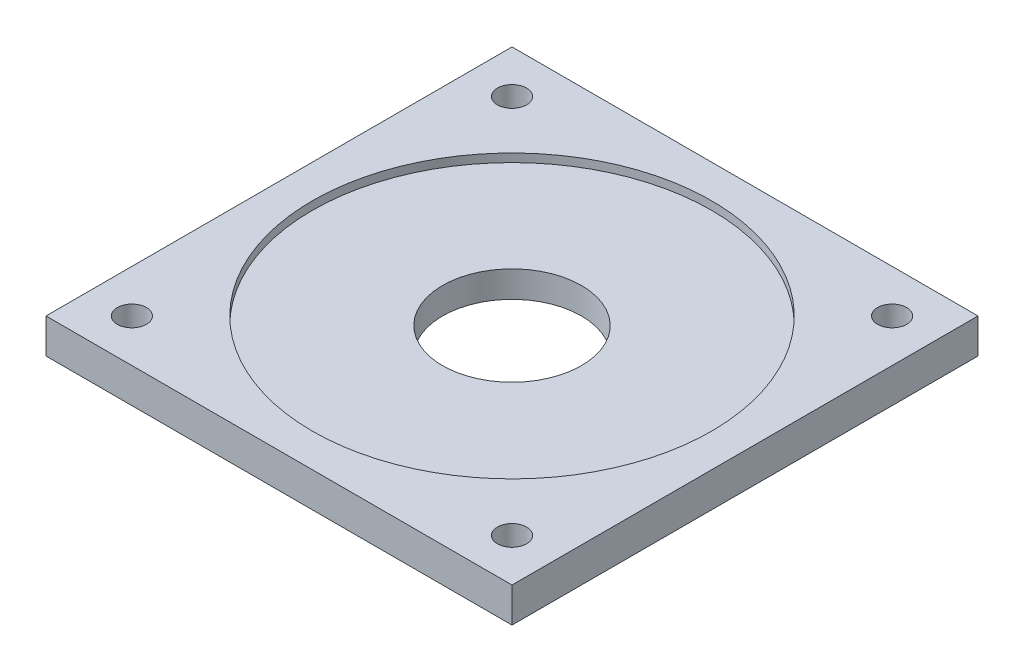
ISO-10303-21;
HEADER;
FILE_DESCRIPTION(('STEP AP214'),'2;1');
FILE_NAME('part.step','',(''),(''),'','','');
FILE_SCHEMA(('AUTOMOTIVE_DESIGN { 1 0 10303 214 1 1 1 1 }'));
ENDSEC;
DATA;
#1=APPLICATION_CONTEXT('core data for automotive mechanical design processes');
#2=APPLICATION_PROTOCOL_DEFINITION('international standard','automotive_design',2000,#1);
#3=PRODUCT_CONTEXT('',#1,'mechanical');
#4=PRODUCT('Part','Part','',(#3));
#5=PRODUCT_RELATED_PRODUCT_CATEGORY('part','',(#4));
#6=PRODUCT_DEFINITION_FORMATION('','',#4);
#7=PRODUCT_DEFINITION_CONTEXT('part definition',#1,'design');
#8=PRODUCT_DEFINITION('design','',#6,#7);
#9=PRODUCT_DEFINITION_SHAPE('','',#8);
#10=(LENGTH_UNIT() NAMED_UNIT(*) SI_UNIT(.MILLI.,.METRE.));
#11=(NAMED_UNIT(*) PLANE_ANGLE_UNIT() SI_UNIT($,.RADIAN.));
#12=(NAMED_UNIT(*) SI_UNIT($,.STERADIAN.) SOLID_ANGLE_UNIT());
#13=UNCERTAINTY_MEASURE_WITH_UNIT(LENGTH_MEASURE(1.E-05),#10,'distance_accuracy_value','');
#14=(GEOMETRIC_REPRESENTATION_CONTEXT(3) GLOBAL_UNCERTAINTY_ASSIGNED_CONTEXT((#13)) GLOBAL_UNIT_ASSIGNED_CONTEXT((#10,
#11,#12)) REPRESENTATION_CONTEXT('',''));
#15=CARTESIAN_POINT('',(0.,0.,0.));
#16=DIRECTION('',(0.,0.,1.));
#17=DIRECTION('',(1.,0.,0.));
#18=AXIS2_PLACEMENT_3D('',#15,#16,#17);
#19=CARTESIAN_POINT('',(0.,-0.00100000000000013,0.));
#20=DIRECTION('',(0.,1.,0.));
#21=DIRECTION('',(0.,0.,1.));
#22=AXIS2_PLACEMENT_3D('',#19,#20,#21);
#23=CYLINDRICAL_SURFACE('',#22,36.49);
#24=CARTESIAN_POINT('',(0.,6.35,0.));
#25=DIRECTION('',(0.,1.,0.));
#26=DIRECTION('',(0.,0.,1.));
#27=AXIS2_PLACEMENT_3D('',#24,#25,#26);
#28=CIRCLE('',#27,36.49);
#29=CARTESIAN_POINT('',(0.,6.35,36.49));
#30=VERTEX_POINT('',#29);
#31=EDGE_CURVE('E116',#30,#30,#28,.T.);
#32=ORIENTED_EDGE('',*,*,#31,.T.);
#33=EDGE_LOOP('',(#32));
#34=FACE_BOUND('',#33,.T.);
#35=CARTESIAN_POINT('',(0.,4.83,0.));
#36=DIRECTION('',(0.,-1.,0.));
#37=DIRECTION('',(0.,0.,-1.));
#38=AXIS2_PLACEMENT_3D('',#35,#36,#37);
#39=CIRCLE('',#38,36.49);
#40=CARTESIAN_POINT('',(0.,4.83,-36.49));
#41=VERTEX_POINT('',#40);
#42=EDGE_CURVE('E11',#41,#41,#39,.F.);
#43=ORIENTED_EDGE('',*,*,#42,.F.);
#44=EDGE_LOOP('',(#43));
#45=FACE_BOUND('',#44,.T.);
#46=ADVANCED_FACE('F39',(#34,#45),#23,.F.);
#47=CARTESIAN_POINT('',(42.6,6.35,42.6));
#48=DIRECTION('',(-1.,0.,0.));
#49=DIRECTION('',(0.,0.,1.));
#50=AXIS2_PLACEMENT_3D('',#47,#48,#49);
#51=PLANE('',#50);
#52=DIRECTION('',(0.,0.,-1.));
#53=VECTOR('',#52,1.);
#54=CARTESIAN_POINT('',(42.6,0.,42.6));
#55=LINE('',#54,#53);
#56=CARTESIAN_POINT('',(42.6,0.,42.6));
#57=VERTEX_POINT('',#56);
#58=CARTESIAN_POINT('',(42.6,0.,-42.6));
#59=VERTEX_POINT('',#58);
#60=EDGE_CURVE('E112',#57,#59,#55,.T.);
#61=ORIENTED_EDGE('',*,*,#60,.T.);
#62=DIRECTION('',(0.,-1.,0.));
#63=VECTOR('',#62,1.);
#64=CARTESIAN_POINT('',(42.6,6.35,-42.6));
#65=LINE('',#64,#63);
#66=CARTESIAN_POINT('',(42.6,6.35,-42.6));
#67=VERTEX_POINT('',#66);
#68=EDGE_CURVE('E49',#67,#59,#65,.T.);
#69=ORIENTED_EDGE('',*,*,#68,.F.);
#70=DIRECTION('',(0.,0.,-1.));
#71=VECTOR('',#70,1.);
#72=CARTESIAN_POINT('',(42.6,6.35,42.6));
#73=LINE('',#72,#71);
#74=CARTESIAN_POINT('',(42.6,6.35,42.6));
#75=VERTEX_POINT('',#74);
#76=EDGE_CURVE('E95',#75,#67,#73,.T.);
#77=ORIENTED_EDGE('',*,*,#76,.F.);
#78=DIRECTION('',(0.,-1.,0.));
#79=VECTOR('',#78,1.);
#80=CARTESIAN_POINT('',(42.6,6.35,42.6));
#81=LINE('',#80,#79);
#82=EDGE_CURVE('E108',#75,#57,#81,.T.);
#83=ORIENTED_EDGE('',*,*,#82,.T.);
#84=EDGE_LOOP('',(#61,#69,#77,#83));
#85=FACE_BOUND('',#84,.T.);
#86=ADVANCED_FACE('F41',(#85),#51,.F.);
#87=CARTESIAN_POINT('',(-42.6,6.35,-42.6));
#88=DIRECTION('',(0.,0.,1.));
#89=DIRECTION('',(1.,0.,0.));
#90=AXIS2_PLACEMENT_3D('',#87,#88,#89);
#91=PLANE('',#90);
#92=DIRECTION('',(-1.,0.,0.));
#93=VECTOR('',#92,1.);
#94=CARTESIAN_POINT('',(-42.6,0.,-42.6));
#95=LINE('',#94,#93);
#96=CARTESIAN_POINT('',(-42.6,0.,-42.6));
#97=VERTEX_POINT('',#96);
#98=EDGE_CURVE('E101',#59,#97,#95,.T.);
#99=ORIENTED_EDGE('',*,*,#98,.T.);
#100=DIRECTION('',(0.,-1.,0.));
#101=VECTOR('',#100,1.);
#102=CARTESIAN_POINT('',(-42.6,6.35,-42.6));
#103=LINE('',#102,#101);
#104=CARTESIAN_POINT('',(-42.6,6.35,-42.6));
#105=VERTEX_POINT('',#104);
#106=EDGE_CURVE('E99',#105,#97,#103,.T.);
#107=ORIENTED_EDGE('',*,*,#106,.F.);
#108=DIRECTION('',(-1.,0.,0.));
#109=VECTOR('',#108,1.);
#110=CARTESIAN_POINT('',(-42.6,6.35,-42.6));
#111=LINE('',#110,#109);
#112=EDGE_CURVE('E90',#67,#105,#111,.T.);
#113=ORIENTED_EDGE('',*,*,#112,.F.);
#114=ORIENTED_EDGE('',*,*,#68,.T.);
#115=EDGE_LOOP('',(#99,#107,#113,#114));
#116=FACE_BOUND('',#115,.T.);
#117=ADVANCED_FACE('F100',(#116),#91,.F.);
#118=CARTESIAN_POINT('',(-42.6,6.35,42.6));
#119=DIRECTION('',(1.,0.,0.));
#120=DIRECTION('',(0.,0.,-1.));
#121=AXIS2_PLACEMENT_3D('',#118,#119,#120);
#122=PLANE('',#121);
#123=DIRECTION('',(0.,0.,1.));
#124=VECTOR('',#123,1.);
#125=CARTESIAN_POINT('',(-42.6,0.,42.6));
#126=LINE('',#125,#124);
#127=CARTESIAN_POINT('',(-42.6,0.,42.6));
#128=VERTEX_POINT('',#127);
#129=EDGE_CURVE('E76',#97,#128,#126,.T.);
#130=ORIENTED_EDGE('',*,*,#129,.T.);
#131=DIRECTION('',(0.,-1.,0.));
#132=VECTOR('',#131,1.);
#133=CARTESIAN_POINT('',(-42.6,6.35,42.6));
#134=LINE('',#133,#132);
#135=CARTESIAN_POINT('',(-42.6,6.35,42.6));
#136=VERTEX_POINT('',#135);
#137=EDGE_CURVE('E103',#136,#128,#134,.T.);
#138=ORIENTED_EDGE('',*,*,#137,.F.);
#139=DIRECTION('',(0.,0.,1.));
#140=VECTOR('',#139,1.);
#141=CARTESIAN_POINT('',(-42.6,6.35,42.6));
#142=LINE('',#141,#140);
#143=EDGE_CURVE('E93',#105,#136,#142,.T.);
#144=ORIENTED_EDGE('',*,*,#143,.F.);
#145=ORIENTED_EDGE('',*,*,#106,.T.);
#146=EDGE_LOOP('',(#130,#138,#144,#145));
#147=FACE_BOUND('',#146,.T.);
#148=ADVANCED_FACE('F105',(#147),#122,.F.);
#149=CARTESIAN_POINT('',(-42.6,6.35,42.6));
#150=DIRECTION('',(0.,0.,-1.));
#151=DIRECTION('',(-1.,0.,0.));
#152=AXIS2_PLACEMENT_3D('',#149,#150,#151);
#153=PLANE('',#152);
#154=DIRECTION('',(1.,0.,0.));
#155=VECTOR('',#154,1.);
#156=CARTESIAN_POINT('',(-42.6,0.,42.6));
#157=LINE('',#156,#155);
#158=EDGE_CURVE('E82',#128,#57,#157,.T.);
#159=ORIENTED_EDGE('',*,*,#158,.T.);
#160=ORIENTED_EDGE('',*,*,#82,.F.);
#161=DIRECTION('',(1.,0.,0.));
#162=VECTOR('',#161,1.);
#163=CARTESIAN_POINT('',(-42.6,6.35,42.6));
#164=LINE('',#163,#162);
#165=EDGE_CURVE('E59',#136,#75,#164,.T.);
#166=ORIENTED_EDGE('',*,*,#165,.F.);
#167=ORIENTED_EDGE('',*,*,#137,.T.);
#168=EDGE_LOOP('',(#159,#160,#166,#167));
#169=FACE_BOUND('',#168,.T.);
#170=ADVANCED_FACE('F194',(#169),#153,.F.);
#171=CARTESIAN_POINT('',(0.,6.35,0.));
#172=DIRECTION('',(0.,-1.,0.));
#173=DIRECTION('',(0.,0.,-1.));
#174=AXIS2_PLACEMENT_3D('',#171,#172,#173);
#175=PLANE('',#174);
#176=CARTESIAN_POINT('',(34.7499999999997,6.35,-34.7500000000003));
#177=DIRECTION('',(0.,-1.,0.));
#178=DIRECTION('',(0.,0.,-1.));
#179=AXIS2_PLACEMENT_3D('',#176,#177,#178);
#180=CIRCLE('',#179,2.665);
#181=CARTESIAN_POINT('',(34.7499999999997,6.35,-37.4150000000003));
#182=VERTEX_POINT('',#181);
#183=EDGE_CURVE('E162',#182,#182,#180,.F.);
#184=ORIENTED_EDGE('',*,*,#183,.F.);
#185=EDGE_LOOP('',(#184));
#186=FACE_BOUND('',#185,.T.);
#187=CARTESIAN_POINT('',(34.7500000000002,6.35,34.7499999999998));
#188=DIRECTION('',(0.,-1.,0.));
#189=DIRECTION('',(0.,0.,-1.));
#190=AXIS2_PLACEMENT_3D('',#187,#188,#189);
#191=CIRCLE('',#190,2.665);
#192=CARTESIAN_POINT('',(34.7500000000002,6.35,32.0849999999998));
#193=VERTEX_POINT('',#192);
#194=EDGE_CURVE('E155',#193,#193,#191,.F.);
#195=ORIENTED_EDGE('',*,*,#194,.F.);
#196=EDGE_LOOP('',(#195));
#197=FACE_BOUND('',#196,.T.);
#198=CARTESIAN_POINT('',(-34.7499999999999,6.35,34.7500000000001));
#199=DIRECTION('',(0.,-1.,0.));
#200=DIRECTION('',(0.,0.,-1.));
#201=AXIS2_PLACEMENT_3D('',#198,#199,#200);
#202=CIRCLE('',#201,2.665);
#203=CARTESIAN_POINT('',(-34.7499999999999,6.35,32.0850000000001));
#204=VERTEX_POINT('',#203);
#205=EDGE_CURVE('E170',#204,#204,#202,.F.);
#206=ORIENTED_EDGE('',*,*,#205,.F.);
#207=EDGE_LOOP('',(#206));
#208=FACE_BOUND('',#207,.T.);
#209=CARTESIAN_POINT('',(-34.75,6.35,-34.75));
#210=DIRECTION('',(0.,-1.,0.));
#211=DIRECTION('',(0.,0.,-1.));
#212=AXIS2_PLACEMENT_3D('',#209,#210,#211);
#213=CIRCLE('',#212,2.665);
#214=CARTESIAN_POINT('',(-34.75,6.35,-37.415));
#215=VERTEX_POINT('',#214);
#216=EDGE_CURVE('E140',#215,#215,#213,.F.);
#217=ORIENTED_EDGE('',*,*,#216,.F.);
#218=EDGE_LOOP('',(#217));
#219=FACE_BOUND('',#218,.T.);
#220=ORIENTED_EDGE('',*,*,#31,.F.);
#221=EDGE_LOOP('',(#220));
#222=FACE_BOUND('',#221,.T.);
#223=ORIENTED_EDGE('',*,*,#76,.T.);
#224=ORIENTED_EDGE('',*,*,#112,.T.);
#225=ORIENTED_EDGE('',*,*,#143,.T.);
#226=ORIENTED_EDGE('',*,*,#165,.T.);
#227=EDGE_LOOP('',(#223,#224,#225,#226));
#228=FACE_BOUND('',#227,.T.);
#229=ADVANCED_FACE('F91',(#186,#197,#208,#219,#222,#228),#175,.F.);
#230=CARTESIAN_POINT('',(0.,0.,0.));
#231=DIRECTION('',(0.,-1.,0.));
#232=DIRECTION('',(0.,0.,-1.));
#233=AXIS2_PLACEMENT_3D('',#230,#231,#232);
#234=PLANE('',#233);
#235=CARTESIAN_POINT('',(34.7499999999997,0.,-34.7500000000003));
#236=DIRECTION('',(0.,-1.,0.));
#237=DIRECTION('',(0.,0.,-1.));
#238=AXIS2_PLACEMENT_3D('',#235,#236,#237);
#239=CIRCLE('',#238,2.665);
#240=CARTESIAN_POINT('',(34.7499999999997,0.,-37.4150000000003));
#241=VERTEX_POINT('',#240);
#242=EDGE_CURVE('E165',#241,#241,#239,.T.);
#243=ORIENTED_EDGE('',*,*,#242,.F.);
#244=EDGE_LOOP('',(#243));
#245=FACE_BOUND('',#244,.T.);
#246=CARTESIAN_POINT('',(34.7500000000002,0.,34.7499999999998));
#247=DIRECTION('',(0.,-1.,0.));
#248=DIRECTION('',(0.,0.,-1.));
#249=AXIS2_PLACEMENT_3D('',#246,#247,#248);
#250=CIRCLE('',#249,2.665);
#251=CARTESIAN_POINT('',(34.7500000000002,0.,32.0849999999998));
#252=VERTEX_POINT('',#251);
#253=EDGE_CURVE('E159',#252,#252,#250,.T.);
#254=ORIENTED_EDGE('',*,*,#253,.F.);
#255=EDGE_LOOP('',(#254));
#256=FACE_BOUND('',#255,.T.);
#257=CARTESIAN_POINT('',(-34.7499999999999,0.,34.7500000000001));
#258=DIRECTION('',(0.,-1.,0.));
#259=DIRECTION('',(0.,0.,-1.));
#260=AXIS2_PLACEMENT_3D('',#257,#258,#259);
#261=CIRCLE('',#260,2.665);
#262=CARTESIAN_POINT('',(-34.7499999999999,0.,32.0850000000001));
#263=VERTEX_POINT('',#262);
#264=EDGE_CURVE('E158',#263,#263,#261,.T.);
#265=ORIENTED_EDGE('',*,*,#264,.F.);
#266=EDGE_LOOP('',(#265));
#267=FACE_BOUND('',#266,.T.);
#268=CARTESIAN_POINT('',(-34.75,0.,-34.75));
#269=DIRECTION('',(0.,-1.,0.));
#270=DIRECTION('',(0.,0.,-1.));
#271=AXIS2_PLACEMENT_3D('',#268,#269,#270);
#272=CIRCLE('',#271,2.665);
#273=CARTESIAN_POINT('',(-34.75,0.,-37.415));
#274=VERTEX_POINT('',#273);
#275=EDGE_CURVE('E148',#274,#274,#272,.T.);
#276=ORIENTED_EDGE('',*,*,#275,.F.);
#277=EDGE_LOOP('',(#276));
#278=FACE_BOUND('',#277,.T.);
#279=ORIENTED_EDGE('',*,*,#60,.F.);
#280=ORIENTED_EDGE('',*,*,#158,.F.);
#281=ORIENTED_EDGE('',*,*,#129,.F.);
#282=ORIENTED_EDGE('',*,*,#98,.F.);
#283=EDGE_LOOP('',(#279,#280,#281,#282));
#284=FACE_BOUND('',#283,.T.);
#285=CARTESIAN_POINT('',(0.,0.,0.));
#286=DIRECTION('',(0.,-1.,0.));
#287=DIRECTION('',(0.,0.,-1.));
#288=AXIS2_PLACEMENT_3D('',#285,#286,#287);
#289=CIRCLE('',#288,12.7);
#290=CARTESIAN_POINT('',(0.,0.,-12.7));
#291=VERTEX_POINT('',#290);
#292=EDGE_CURVE('E136',#291,#291,#289,.T.);
#293=ORIENTED_EDGE('',*,*,#292,.F.);
#294=EDGE_LOOP('',(#293));
#295=FACE_BOUND('',#294,.T.);
#296=ADVANCED_FACE('F128',(#245,#256,#267,#278,#284,#295),#234,.T.);
#297=CARTESIAN_POINT('',(0.,4.83,0.));
#298=DIRECTION('',(0.,-1.,0.));
#299=DIRECTION('',(0.,0.,-1.));
#300=AXIS2_PLACEMENT_3D('',#297,#298,#299);
#301=PLANE('',#300);
#302=CARTESIAN_POINT('',(0.,4.83,0.));
#303=DIRECTION('',(0.,-1.,0.));
#304=DIRECTION('',(0.,0.,-1.));
#305=AXIS2_PLACEMENT_3D('',#302,#303,#304);
#306=CIRCLE('',#305,12.7);
#307=CARTESIAN_POINT('',(0.,4.83,-12.7));
#308=VERTEX_POINT('',#307);
#309=EDGE_CURVE('E139',#308,#308,#306,.T.);
#310=ORIENTED_EDGE('',*,*,#309,.T.);
#311=EDGE_LOOP('',(#310));
#312=FACE_BOUND('',#311,.T.);
#313=ORIENTED_EDGE('',*,*,#42,.T.);
#314=EDGE_LOOP('',(#313));
#315=FACE_BOUND('',#314,.T.);
#316=ADVANCED_FACE('F131',(#312,#315),#301,.F.);
#317=CARTESIAN_POINT('',(0.,4.83,0.));
#318=DIRECTION('',(0.,-1.,0.));
#319=DIRECTION('',(0.,0.,-1.));
#320=AXIS2_PLACEMENT_3D('',#317,#318,#319);
#321=CYLINDRICAL_SURFACE('',#320,12.7);
#322=ORIENTED_EDGE('',*,*,#309,.F.);
#323=EDGE_LOOP('',(#322));
#324=FACE_BOUND('',#323,.T.);
#325=ORIENTED_EDGE('',*,*,#292,.T.);
#326=EDGE_LOOP('',(#325));
#327=FACE_BOUND('',#326,.T.);
#328=ADVANCED_FACE('F207',(#324,#327),#321,.F.);
#329=CARTESIAN_POINT('',(-34.75,6.351,-34.75));
#330=DIRECTION('',(0.,-1.,0.));
#331=DIRECTION('',(0.,0.,-1.));
#332=AXIS2_PLACEMENT_3D('',#329,#330,#331);
#333=CYLINDRICAL_SURFACE('',#332,2.665);
#334=ORIENTED_EDGE('',*,*,#275,.T.);
#335=EDGE_LOOP('',(#334));
#336=FACE_BOUND('',#335,.T.);
#337=ORIENTED_EDGE('',*,*,#216,.T.);
#338=EDGE_LOOP('',(#337));
#339=FACE_BOUND('',#338,.T.);
#340=ADVANCED_FACE('F188',(#336,#339),#333,.F.);
#341=CARTESIAN_POINT('',(-34.7499999999999,6.351,34.7500000000001));
#342=DIRECTION('',(0.,-1.,0.));
#343=DIRECTION('',(0.,0.,-1.));
#344=AXIS2_PLACEMENT_3D('',#341,#342,#343);
#345=CYLINDRICAL_SURFACE('',#344,2.665);
#346=ORIENTED_EDGE('',*,*,#264,.T.);
#347=EDGE_LOOP('',(#346));
#348=FACE_BOUND('',#347,.T.);
#349=ORIENTED_EDGE('',*,*,#205,.T.);
#350=EDGE_LOOP('',(#349));
#351=FACE_BOUND('',#350,.T.);
#352=ADVANCED_FACE('F182',(#348,#351),#345,.F.);
#353=CARTESIAN_POINT('',(34.7500000000002,6.351,34.7499999999998));
#354=DIRECTION('',(0.,-1.,0.));
#355=DIRECTION('',(0.,0.,-1.));
#356=AXIS2_PLACEMENT_3D('',#353,#354,#355);
#357=CYLINDRICAL_SURFACE('',#356,2.665);
#358=ORIENTED_EDGE('',*,*,#253,.T.);
#359=EDGE_LOOP('',(#358));
#360=FACE_BOUND('',#359,.T.);
#361=ORIENTED_EDGE('',*,*,#194,.T.);
#362=EDGE_LOOP('',(#361));
#363=FACE_BOUND('',#362,.T.);
#364=ADVANCED_FACE('F187',(#360,#363),#357,.F.);
#365=CARTESIAN_POINT('',(34.7499999999997,6.351,-34.7500000000003));
#366=DIRECTION('',(0.,-1.,0.));
#367=DIRECTION('',(0.,0.,-1.));
#368=AXIS2_PLACEMENT_3D('',#365,#366,#367);
#369=CYLINDRICAL_SURFACE('',#368,2.665);
#370=ORIENTED_EDGE('',*,*,#242,.T.);
#371=EDGE_LOOP('',(#370));
#372=FACE_BOUND('',#371,.T.);
#373=ORIENTED_EDGE('',*,*,#183,.T.);
#374=EDGE_LOOP('',(#373));
#375=FACE_BOUND('',#374,.T.);
#376=ADVANCED_FACE('F261',(#372,#375),#369,.F.);
#377=CLOSED_SHELL('',(#46,#86,#117,#148,#170,#229,#296,#316,#328,#340,#352,#364,#376));
#378=MANIFOLD_SOLID_BREP('B2',#377);
#379=ADVANCED_BREP_SHAPE_REPRESENTATION('',(#18,#378),#14);
#380=SHAPE_DEFINITION_REPRESENTATION(#9,#379);
ENDSEC;
END-ISO-10303-21;
